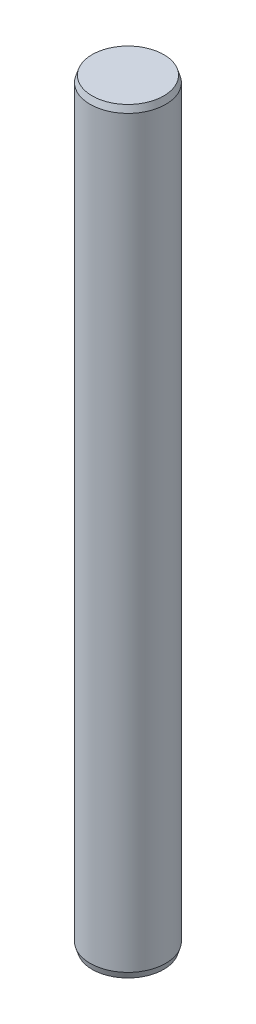
ISO-10303-21;
HEADER;
FILE_DESCRIPTION(('STEP AP214'),'2;1');
FILE_NAME('part.step','',(''),(''),'','','');
FILE_SCHEMA(('AUTOMOTIVE_DESIGN { 1 0 10303 214 1 1 1 1 }'));
ENDSEC;
DATA;
#1=APPLICATION_CONTEXT('core data for automotive mechanical design processes');
#2=APPLICATION_PROTOCOL_DEFINITION('international standard','automotive_design',2000,#1);
#3=PRODUCT_CONTEXT('',#1,'mechanical');
#4=PRODUCT('Part','Part','',(#3));
#5=PRODUCT_RELATED_PRODUCT_CATEGORY('part','',(#4));
#6=PRODUCT_DEFINITION_FORMATION('','',#4);
#7=PRODUCT_DEFINITION_CONTEXT('part definition',#1,'design');
#8=PRODUCT_DEFINITION('design','',#6,#7);
#9=PRODUCT_DEFINITION_SHAPE('','',#8);
#10=(LENGTH_UNIT() NAMED_UNIT(*) SI_UNIT(.MILLI.,.METRE.));
#11=(NAMED_UNIT(*) PLANE_ANGLE_UNIT() SI_UNIT($,.RADIAN.));
#12=(NAMED_UNIT(*) SI_UNIT($,.STERADIAN.) SOLID_ANGLE_UNIT());
#13=UNCERTAINTY_MEASURE_WITH_UNIT(LENGTH_MEASURE(1.E-05),#10,'distance_accuracy_value','');
#14=(GEOMETRIC_REPRESENTATION_CONTEXT(3) GLOBAL_UNCERTAINTY_ASSIGNED_CONTEXT((#13)) GLOBAL_UNIT_ASSIGNED_CONTEXT((#10,
#11,#12)) REPRESENTATION_CONTEXT('',''));
#15=CARTESIAN_POINT('',(0.,0.,0.));
#16=DIRECTION('',(0.,0.,1.));
#17=DIRECTION('',(1.,0.,0.));
#18=AXIS2_PLACEMENT_3D('',#15,#16,#17);
#19=CARTESIAN_POINT('',(0.,30.,0.));
#20=DIRECTION('',(0.,1.,0.));
#21=DIRECTION('',(1.,0.,0.));
#22=AXIS2_PLACEMENT_3D('',#19,#20,#21);
#23=PLANE('',#22);
#24=CARTESIAN_POINT('',(0.,30.,0.));
#25=DIRECTION('',(0.,1.,0.));
#26=DIRECTION('',(-1.,0.,0.));
#27=AXIS2_PLACEMENT_3D('',#24,#25,#26);
#28=CIRCLE('',#27,1.42);
#29=CARTESIAN_POINT('',(0.,30.,1.41999999999909));
#30=VERTEX_POINT('',#29);
#31=EDGE_CURVE('E11',#30,#30,#28,.T.);
#32=ORIENTED_EDGE('',*,*,#31,.T.);
#33=EDGE_LOOP('',(#32));
#34=FACE_BOUND('',#33,.T.);
#35=ADVANCED_FACE('F17',(#34),#23,.T.);
#36=CARTESIAN_POINT('',(0.,29.87500000705,0.));
#37=DIRECTION('',(0.,-1.,0.));
#38=DIRECTION('',(0.,0.,-1.));
#39=AXIS2_PLACEMENT_3D('',#36,#37,#38);
#40=CONICAL_SURFACE('',#39,1.459999997743,0.30970294454251);
#41=CARTESIAN_POINT('',(0.,29.75,0.));
#42=DIRECTION('',(0.,1.,0.));
#43=DIRECTION('',(-1.,0.,0.));
#44=AXIS2_PLACEMENT_3D('',#41,#42,#43);
#45=CIRCLE('',#44,1.5);
#46=CARTESIAN_POINT('',(0.,29.75,1.4999999999991));
#47=VERTEX_POINT('',#46);
#48=CARTESIAN_POINT('',(-1.5,29.75,0.));
#49=VERTEX_POINT('',#48);
#50=EDGE_CURVE('E84',#47,#49,#45,.T.);
#51=ORIENTED_EDGE('',*,*,#50,.T.);
#52=CARTESIAN_POINT('',(0.,29.75,0.));
#53=DIRECTION('',(0.,1.,0.));
#54=DIRECTION('',(-1.,0.,0.));
#55=AXIS2_PLACEMENT_3D('',#52,#53,#54);
#56=CIRCLE('',#55,1.5);
#57=EDGE_CURVE('E88',#49,#47,#56,.T.);
#58=ORIENTED_EDGE('',*,*,#57,.T.);
#59=DIRECTION('',(0.,0.952424147199308,-0.304775727103835));
#60=VECTOR('',#59,1.);
#61=CARTESIAN_POINT('',(0.,29.87500000705,1.459999997743));
#62=LINE('',#61,#60);
#63=EDGE_CURVE('E25',#47,#30,#62,.T.);
#64=ORIENTED_EDGE('',*,*,#63,.T.);
#65=ORIENTED_EDGE('',*,*,#31,.F.);
#66=ORIENTED_EDGE('',*,*,#63,.F.);
#67=EDGE_LOOP('',(#51,#58,#64,#65,#66));
#68=FACE_BOUND('',#67,.T.);
#69=ADVANCED_FACE('F98',(#68),#40,.T.);
#70=CARTESIAN_POINT('',(0.,0.,0.));
#71=DIRECTION('',(0.,1.,0.));
#72=DIRECTION('',(1.,0.,0.));
#73=AXIS2_PLACEMENT_3D('',#70,#71,#72);
#74=CYLINDRICAL_SURFACE('',#73,1.5);
#75=ORIENTED_EDGE('',*,*,#50,.F.);
#76=ORIENTED_EDGE('',*,*,#57,.F.);
#77=DIRECTION('',(0.,-1.,0.));
#78=VECTOR('',#77,1.);
#79=CARTESIAN_POINT('',(-1.5,0.,0.));
#80=LINE('',#79,#78);
#81=CARTESIAN_POINT('',(-1.5,0.25,0.));
#82=VERTEX_POINT('',#81);
#83=EDGE_CURVE('E42',#49,#82,#80,.T.);
#84=ORIENTED_EDGE('',*,*,#83,.T.);
#85=CARTESIAN_POINT('',(0.,0.25,0.));
#86=DIRECTION('',(0.,-1.,0.));
#87=DIRECTION('',(-1.,0.,0.));
#88=AXIS2_PLACEMENT_3D('',#85,#86,#87);
#89=CIRCLE('',#88,1.5);
#90=CARTESIAN_POINT('',(0.,0.24999999999988,1.50000000000038));
#91=VERTEX_POINT('',#90);
#92=EDGE_CURVE('E70',#91,#82,#89,.T.);
#93=ORIENTED_EDGE('',*,*,#92,.F.);
#94=CARTESIAN_POINT('',(0.,0.25,0.));
#95=DIRECTION('',(0.,-1.,0.));
#96=DIRECTION('',(-1.,0.,0.));
#97=AXIS2_PLACEMENT_3D('',#94,#95,#96);
#98=CIRCLE('',#97,1.5);
#99=EDGE_CURVE('E68',#82,#91,#98,.T.);
#100=ORIENTED_EDGE('',*,*,#99,.F.);
#101=ORIENTED_EDGE('',*,*,#83,.F.);
#102=EDGE_LOOP('',(#75,#76,#84,#93,#100,#101));
#103=FACE_BOUND('',#102,.T.);
#104=ADVANCED_FACE('F99',(#103),#74,.T.);
#105=CARTESIAN_POINT('',(0.,0.1249999929456,0.));
#106=DIRECTION('',(0.,1.,0.));
#107=DIRECTION('',(0.,0.,-1.));
#108=AXIS2_PLACEMENT_3D('',#105,#106,#107);
#109=CONICAL_SURFACE('',#108,1.459999997743,0.30970294454251);
#110=ORIENTED_EDGE('',*,*,#99,.T.);
#111=DIRECTION('',(0.,-0.952424147199308,-0.304775727103835));
#112=VECTOR('',#111,1.);
#113=CARTESIAN_POINT('',(0.,0.1249999929456,1.459999997743));
#114=LINE('',#113,#112);
#115=CARTESIAN_POINT('',(0.,-1.16365250768524E-13,1.42000000000036));
#116=VERTEX_POINT('',#115);
#117=EDGE_CURVE('E63',#91,#116,#114,.T.);
#118=ORIENTED_EDGE('',*,*,#117,.T.);
#119=CARTESIAN_POINT('',(0.,0.,0.));
#120=DIRECTION('',(0.,-1.,0.));
#121=DIRECTION('',(-1.,0.,0.));
#122=AXIS2_PLACEMENT_3D('',#119,#120,#121);
#123=CIRCLE('',#122,1.42);
#124=EDGE_CURVE('E66',#116,#116,#123,.T.);
#125=ORIENTED_EDGE('',*,*,#124,.F.);
#126=ORIENTED_EDGE('',*,*,#117,.F.);
#127=ORIENTED_EDGE('',*,*,#92,.T.);
#128=EDGE_LOOP('',(#110,#118,#125,#126,#127));
#129=FACE_BOUND('',#128,.T.);
#130=ADVANCED_FACE('F65',(#129),#109,.T.);
#131=CARTESIAN_POINT('',(0.,0.,0.));
#132=DIRECTION('',(0.,1.,0.));
#133=DIRECTION('',(1.,0.,0.));
#134=AXIS2_PLACEMENT_3D('',#131,#132,#133);
#135=PLANE('',#134);
#136=ORIENTED_EDGE('',*,*,#124,.T.);
#137=EDGE_LOOP('',(#136));
#138=FACE_BOUND('',#137,.T.);
#139=ADVANCED_FACE('F73',(#138),#135,.F.);
#140=CLOSED_SHELL('',(#35,#69,#104,#130,#139));
#141=MANIFOLD_SOLID_BREP('B1',#140);
#142=ADVANCED_BREP_SHAPE_REPRESENTATION('',(#18,#141),#14);
#143=SHAPE_DEFINITION_REPRESENTATION(#9,#142);
ENDSEC;
END-ISO-10303-21;
